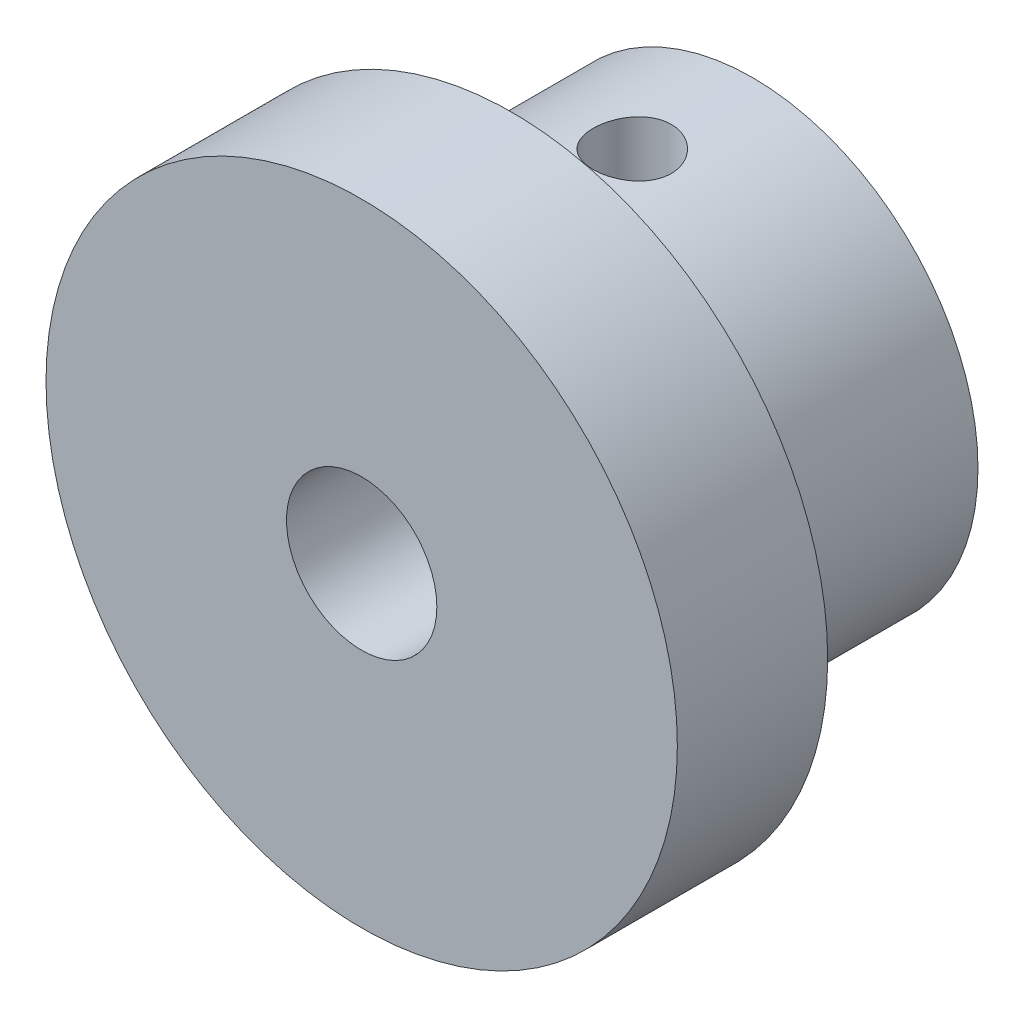
ISO-10303-21;
HEADER;
FILE_DESCRIPTION(('STEP AP214'),'2;1');
FILE_NAME('part.step','',(''),(''),'','','');
FILE_SCHEMA(('AUTOMOTIVE_DESIGN { 1 0 10303 214 1 1 1 1 }'));
ENDSEC;
DATA;
#1=APPLICATION_CONTEXT('core data for automotive mechanical design processes');
#2=APPLICATION_PROTOCOL_DEFINITION('international standard','automotive_design',2000,#1);
#3=PRODUCT_CONTEXT('',#1,'mechanical');
#4=PRODUCT('Part','Part','',(#3));
#5=PRODUCT_RELATED_PRODUCT_CATEGORY('part','',(#4));
#6=PRODUCT_DEFINITION_FORMATION('','',#4);
#7=PRODUCT_DEFINITION_CONTEXT('part definition',#1,'design');
#8=PRODUCT_DEFINITION('design','',#6,#7);
#9=PRODUCT_DEFINITION_SHAPE('','',#8);
#10=(LENGTH_UNIT() NAMED_UNIT(*) SI_UNIT(.MILLI.,.METRE.));
#11=(NAMED_UNIT(*) PLANE_ANGLE_UNIT() SI_UNIT($,.RADIAN.));
#12=(NAMED_UNIT(*) SI_UNIT($,.STERADIAN.) SOLID_ANGLE_UNIT());
#13=UNCERTAINTY_MEASURE_WITH_UNIT(LENGTH_MEASURE(1.E-05),#10,'distance_accuracy_value','');
#14=(GEOMETRIC_REPRESENTATION_CONTEXT(3) GLOBAL_UNCERTAINTY_ASSIGNED_CONTEXT((#13)) GLOBAL_UNIT_ASSIGNED_CONTEXT((#10,
#11,#12)) REPRESENTATION_CONTEXT('',''));
#15=CARTESIAN_POINT('',(0.,0.,0.));
#16=DIRECTION('',(0.,0.,1.));
#17=DIRECTION('',(1.,0.,0.));
#18=AXIS2_PLACEMENT_3D('',#15,#16,#17);
#19=CARTESIAN_POINT('',(0.,0.,8.));
#20=DIRECTION('',(0.,0.,-1.));
#21=DIRECTION('',(-1.,0.,0.));
#22=AXIS2_PLACEMENT_3D('',#19,#20,#21);
#23=CYLINDRICAL_SURFACE('',#22,7.5);
#24=CARTESIAN_POINT('',(0.,7.5,5.29999999999999));
#25=CARTESIAN_POINT('',(-0.0724398447909773,7.4999987322731,5.29999713480323));
#26=CARTESIAN_POINT('',(-0.144918145498401,7.49893959111151,5.29392469969313));
#27=CARTESIAN_POINT('',(-0.287838997586658,7.49481648528476,5.26980720285203));
#28=CARTESIAN_POINT('',(-0.358279665172153,7.49175072368937,5.25175140981125));
#29=CARTESIAN_POINT('',(-0.495037056079598,7.48395795984001,5.20423119988986));
#30=CARTESIAN_POINT('',(-0.561357206809018,7.47923236059877,5.17477641611242));
#31=CARTESIAN_POINT('',(-0.688106386865883,7.46863841510139,5.10532023268403));
#32=CARTESIAN_POINT('',(-0.748536027970825,7.46277018770667,5.06531992987327));
#33=CARTESIAN_POINT('',(-0.862419313309423,7.45047302958428,4.97546994807261));
#34=CARTESIAN_POINT('',(-0.915803450002364,7.44403942512245,4.92553279983517));
#35=CARTESIAN_POINT('',(-1.01347965377153,7.43137205523472,4.8174149060784));
#36=CARTESIAN_POINT('',(-1.05777112348898,7.42513830296116,4.75923361937002));
#37=CARTESIAN_POINT('',(-1.13628655313533,7.41353114747344,4.63579725464702));
#38=CARTESIAN_POINT('',(-1.17044116764746,7.40816378000777,4.57049745016679));
#39=CARTESIAN_POINT('',(-1.22726976900563,7.39896228385757,4.43497868799076));
#40=CARTESIAN_POINT('',(-1.24994459662756,7.39512804289169,4.36476009097467));
#41=CARTESIAN_POINT('',(-1.28294969888162,7.38947362434129,4.22213600107243));
#42=CARTESIAN_POINT('',(-1.29340036048532,7.38763381843554,4.14975916042963));
#43=CARTESIAN_POINT('',(-1.30203386434754,7.38611726921512,4.00425767205234));
#44=CARTESIAN_POINT('',(-1.30021764567898,7.38644036032304,3.93113308198861));
#45=CARTESIAN_POINT('',(-1.28446686747754,7.38919519389469,3.78707512790706));
#46=CARTESIAN_POINT('',(-1.2706680508966,7.3916033155293,3.71612640449628));
#47=CARTESIAN_POINT('',(-1.23155703181358,7.39821986273015,3.57756655497503));
#48=CARTESIAN_POINT('',(-1.2062444051644,7.4024283546183,3.50995555192163));
#49=CARTESIAN_POINT('',(-1.14468818219537,7.41219671468858,3.37958683427038));
#50=CARTESIAN_POINT('',(-1.10838869894239,7.41776346317574,3.31685604457137));
#51=CARTESIAN_POINT('',(-1.02592880229732,7.42961640016175,3.19832450375509));
#52=CARTESIAN_POINT('',(-0.979767529700656,7.43590265132482,3.14252435713771));
#53=CARTESIAN_POINT('',(-0.878157183611079,7.44858981776636,3.03865275882683));
#54=CARTESIAN_POINT('',(-0.822591753127176,7.4549911395167,2.99069510793105));
#55=CARTESIAN_POINT('',(-0.704142624944716,7.46710932055715,2.90476642988428));
#56=CARTESIAN_POINT('',(-0.641258872678944,7.47282617474308,2.86679547720346));
#57=CARTESIAN_POINT('',(-0.509847542269497,7.48294040591933,2.80190573776082));
#58=CARTESIAN_POINT('',(-0.441314626026443,7.48733651624691,2.77499755172079));
#59=CARTESIAN_POINT('',(-0.300608863131163,7.4943038992072,2.73310567344243));
#60=CARTESIAN_POINT('',(-0.228436346788359,7.49687533711874,2.71812090116639));
#61=CARTESIAN_POINT('',(-0.0834803980918329,7.49988127256183,2.70065675206772));
#62=CARTESIAN_POINT('',(-0.0107163105793022,7.50034244826514,2.69802124415496));
#63=CARTESIAN_POINT('',(0.134213405536291,7.49914915870502,2.70491339902996));
#64=CARTESIAN_POINT('',(0.206379058988119,7.49749478173288,2.71444055421652));
#65=CARTESIAN_POINT('',(0.347577136871395,7.49227281825126,2.74525774116925));
#66=CARTESIAN_POINT('',(0.416627055425048,7.4887178940511,2.76646994989062));
#67=CARTESIAN_POINT('',(0.55019060066028,7.48009179881856,2.81997175995333));
#68=CARTESIAN_POINT('',(0.614703955345471,7.47502053696749,2.85226202481471));
#69=CARTESIAN_POINT('',(0.738037625215484,7.46385795675312,2.92735722338536));
#70=CARTESIAN_POINT('',(0.796798103735989,7.4577574148199,2.97025903272262));
#71=CARTESIAN_POINT('',(0.90634150089479,7.44523944788984,3.06522690846743));
#72=CARTESIAN_POINT('',(0.957123789046545,7.43882199790155,3.11729369846039));
#73=CARTESIAN_POINT('',(1.04985252732064,7.42630654067611,3.22981588920068));
#74=CARTESIAN_POINT('',(1.09169315146389,7.42021293917705,3.29035906898262));
#75=CARTESIAN_POINT('',(1.16461025617444,7.40911930936297,3.4177063611878));
#76=CARTESIAN_POINT('',(1.19568709751513,7.40411924439757,3.48451026367288));
#77=CARTESIAN_POINT('',(1.24603871655471,7.39581234401479,3.62219518378742));
#78=CARTESIAN_POINT('',(1.26536488229816,7.39249814651775,3.69305694425807));
#79=CARTESIAN_POINT('',(1.2918273435619,7.3879202485671,3.83708358716461));
#80=CARTESIAN_POINT('',(1.29896479440461,7.38665635377357,3.9102482506474));
#81=CARTESIAN_POINT('',(1.30081300007085,7.38633100286296,4.05574612213087));
#82=CARTESIAN_POINT('',(1.2956904288562,7.38724000617502,4.12807720045278));
#83=CARTESIAN_POINT('',(1.2735257904453,7.39109305373654,4.27083133352559));
#84=CARTESIAN_POINT('',(1.2564837712523,7.3940370897903,4.34125439595946));
#85=CARTESIAN_POINT('',(1.21102987982703,7.40161688002661,4.47812121356259));
#86=CARTESIAN_POINT('',(1.18263350198151,7.40625032804721,4.54457025029067));
#87=CARTESIAN_POINT('',(1.11529439301075,7.41668890125424,4.67178799854623));
#88=CARTESIAN_POINT('',(1.07635106935154,7.42249409226526,4.73255639067345));
#89=CARTESIAN_POINT('',(0.988433390708102,7.43471511111115,4.84752777897955));
#90=CARTESIAN_POINT('',(0.939336807660156,7.44113781478104,4.90163659176602));
#91=CARTESIAN_POINT('',(0.832763269696979,7.45381640848232,5.00090416099672));
#92=CARTESIAN_POINT('',(0.775284387370081,7.46007225975557,5.04606085335595));
#93=CARTESIAN_POINT('',(0.653061699085757,7.4717671318827,5.12645560828061));
#94=CARTESIAN_POINT('',(0.588266425916335,7.47719964423843,5.16161638762511));
#95=CARTESIAN_POINT('',(0.453619362629126,7.48657240831697,5.22049906289207));
#96=CARTESIAN_POINT('',(0.383772598483327,7.49051411962616,5.24423215348015));
#97=CARTESIAN_POINT('',(0.261394898595106,7.49561824401892,5.2745359398695));
#98=CARTESIAN_POINT('',(0.209597073046708,7.49725246863215,5.28406935882905));
#99=CARTESIAN_POINT('',(0.105206249994944,7.49944379647523,5.29680236750822));
#100=CARTESIAN_POINT('',(0.0526132680507082,7.5000009207537,5.30000208100066));
#101=CARTESIAN_POINT('',(0.,7.5,5.29999999999999));
#102=B_SPLINE_CURVE_WITH_KNOTS('',3,(#24,#25,#26,#27,#28,#29,#30,#31,#32,#33,#34,#35,#36,#37,
#38,#39,#40,#41,#42,#43,#44,#45,#46,#47,#48,#49,#50,#51,#52,#53,#54,#55,#56,#57,#58,#59,#60,#61,
#62,#63,#64,#65,#66,#67,#68,#69,#70,#71,#72,#73,#74,#75,#76,#77,#78,#79,#80,#81,#82,#83,#84,#85,
#86,#87,#88,#89,#90,#91,#92,#93,#94,#95,#96,#97,#98,#99,#100,#101),.UNSPECIFIED.,.T.,.F.,(4,2,2,
2,2,2,2,2,2,2,2,2,2,2,2,2,2,2,2,2,2,2,2,2,2,2,2,2,2,2,2,2,2,2,2,2,2,2,4),(0.,0.217127189508833,
0.434449083106592,0.651587721116053,0.868703783424172,1.08782304649496,1.30695670038824,
1.52755659405949,1.74814032872786,1.96653289894895,2.18490875063849,2.40084256964326,
2.61678434388797,2.83384355716752,3.05092168936449,3.27091377018255,3.49090749142105,
3.71111152958697,3.93129561912501,4.14868828352059,4.36607187546455,4.58202488542516,
4.79799083214733,5.01600628447353,5.23403895708842,5.45452440261241,5.67500245733491,
5.8945092494248,6.11399523413675,6.33051431214473,6.54703251816937,6.76325626198093,
6.97949215589786,7.19850092823633,7.41756013871473,7.63826959904825,7.85876240832692,
8.01646559370506,8.17416569722804),.UNSPECIFIED.);
#103=CARTESIAN_POINT('',(0.,7.5,5.29999999999999));
#104=VERTEX_POINT('',#103);
#105=EDGE_CURVE('E67',#104,#104,#102,.T.);
#106=ORIENTED_EDGE('',*,*,#105,.T.);
#107=EDGE_LOOP('',(#106));
#108=FACE_BOUND('',#107,.T.);
#109=CARTESIAN_POINT('',(0.,0.,8.));
#110=DIRECTION('',(0.,0.,1.));
#111=DIRECTION('',(1.,0.,0.));
#112=AXIS2_PLACEMENT_3D('',#109,#110,#111);
#113=CIRCLE('',#112,7.5);
#114=CARTESIAN_POINT('',(7.5,0.,8.));
#115=VERTEX_POINT('',#114);
#116=EDGE_CURVE('E10',#115,#115,#113,.T.);
#117=ORIENTED_EDGE('',*,*,#116,.F.);
#118=EDGE_LOOP('',(#117));
#119=FACE_BOUND('',#118,.T.);
#120=CARTESIAN_POINT('',(0.,0.,0.));
#121=DIRECTION('',(0.,0.,1.));
#122=DIRECTION('',(1.,0.,0.));
#123=AXIS2_PLACEMENT_3D('',#120,#121,#122);
#124=CIRCLE('',#123,7.5);
#125=CARTESIAN_POINT('',(7.5,0.,0.));
#126=VERTEX_POINT('',#125);
#127=EDGE_CURVE('E44',#126,#126,#124,.T.);
#128=ORIENTED_EDGE('',*,*,#127,.T.);
#129=EDGE_LOOP('',(#128));
#130=FACE_BOUND('',#129,.T.);
#131=ADVANCED_FACE('F40',(#108,#119,#130),#23,.T.);
#132=CARTESIAN_POINT('',(0.,0.,0.));
#133=DIRECTION('',(0.,0.,1.));
#134=DIRECTION('',(1.,0.,0.));
#135=AXIS2_PLACEMENT_3D('',#132,#133,#134);
#136=PLANE('',#135);
#137=CARTESIAN_POINT('',(0.,0.,0.));
#138=DIRECTION('',(0.,0.,1.));
#139=DIRECTION('',(1.,0.,0.));
#140=AXIS2_PLACEMENT_3D('',#137,#138,#139);
#141=CIRCLE('',#140,2.5);
#142=CARTESIAN_POINT('',(2.5,0.,0.));
#143=VERTEX_POINT('',#142);
#144=EDGE_CURVE('E59',#143,#143,#141,.T.);
#145=ORIENTED_EDGE('',*,*,#144,.T.);
#146=EDGE_LOOP('',(#145));
#147=FACE_BOUND('',#146,.T.);
#148=ORIENTED_EDGE('',*,*,#127,.F.);
#149=EDGE_LOOP('',(#148));
#150=FACE_BOUND('',#149,.T.);
#151=ADVANCED_FACE('F103',(#147,#150),#136,.F.);
#152=CARTESIAN_POINT('',(0.,0.,13.));
#153=DIRECTION('',(0.,0.,-1.));
#154=DIRECTION('',(-1.,0.,0.));
#155=AXIS2_PLACEMENT_3D('',#152,#153,#154);
#156=CYLINDRICAL_SURFACE('',#155,10.5);
#157=CARTESIAN_POINT('',(0.,0.,13.));
#158=DIRECTION('',(0.,0.,1.));
#159=DIRECTION('',(1.,0.,0.));
#160=AXIS2_PLACEMENT_3D('',#157,#158,#159);
#161=CIRCLE('',#160,10.5);
#162=CARTESIAN_POINT('',(10.5,0.,13.));
#163=VERTEX_POINT('',#162);
#164=EDGE_CURVE('E53',#163,#163,#161,.T.);
#165=ORIENTED_EDGE('',*,*,#164,.F.);
#166=EDGE_LOOP('',(#165));
#167=FACE_BOUND('',#166,.T.);
#168=CARTESIAN_POINT('',(0.,0.,8.));
#169=DIRECTION('',(0.,0.,1.));
#170=DIRECTION('',(1.,0.,0.));
#171=AXIS2_PLACEMENT_3D('',#168,#169,#170);
#172=CIRCLE('',#171,10.5);
#173=CARTESIAN_POINT('',(10.5,0.,8.));
#174=VERTEX_POINT('',#173);
#175=EDGE_CURVE('E55',#174,#174,#172,.T.);
#176=ORIENTED_EDGE('',*,*,#175,.T.);
#177=EDGE_LOOP('',(#176));
#178=FACE_BOUND('',#177,.T.);
#179=ADVANCED_FACE('F98',(#167,#178),#156,.T.);
#180=CARTESIAN_POINT('',(0.,0.,13.));
#181=DIRECTION('',(0.,0.,1.));
#182=DIRECTION('',(1.,0.,0.));
#183=AXIS2_PLACEMENT_3D('',#180,#181,#182);
#184=PLANE('',#183);
#185=CARTESIAN_POINT('',(0.,0.,13.));
#186=DIRECTION('',(0.,0.,1.));
#187=DIRECTION('',(1.,0.,0.));
#188=AXIS2_PLACEMENT_3D('',#185,#186,#187);
#189=CIRCLE('',#188,2.5);
#190=CARTESIAN_POINT('',(2.5,0.,13.));
#191=VERTEX_POINT('',#190);
#192=EDGE_CURVE('E63',#191,#191,#189,.T.);
#193=ORIENTED_EDGE('',*,*,#192,.F.);
#194=EDGE_LOOP('',(#193));
#195=FACE_BOUND('',#194,.T.);
#196=ORIENTED_EDGE('',*,*,#164,.T.);
#197=EDGE_LOOP('',(#196));
#198=FACE_BOUND('',#197,.T.);
#199=ADVANCED_FACE('F95',(#195,#198),#184,.T.);
#200=CARTESIAN_POINT('',(0.,0.,8.));
#201=DIRECTION('',(0.,0.,1.));
#202=DIRECTION('',(1.,0.,0.));
#203=AXIS2_PLACEMENT_3D('',#200,#201,#202);
#204=PLANE('',#203);
#205=ORIENTED_EDGE('',*,*,#116,.T.);
#206=EDGE_LOOP('',(#205));
#207=FACE_BOUND('',#206,.T.);
#208=ORIENTED_EDGE('',*,*,#175,.F.);
#209=EDGE_LOOP('',(#208));
#210=FACE_BOUND('',#209,.T.);
#211=ADVANCED_FACE('F93',(#207,#210),#204,.F.);
#212=CARTESIAN_POINT('',(0.,0.,0.));
#213=DIRECTION('',(0.,0.,1.));
#214=DIRECTION('',(1.,0.,0.));
#215=AXIS2_PLACEMENT_3D('',#212,#213,#214);
#216=CYLINDRICAL_SURFACE('',#215,2.5);
#217=CARTESIAN_POINT('',(0.,2.5,5.29999999999999));
#218=CARTESIAN_POINT('',(0.0680113695059634,2.49999609902581,5.29999558097968));
#219=CARTESIAN_POINT('',(0.136093788180357,2.49719546987896,5.29463162297653));
#220=CARTESIAN_POINT('',(0.270225454250749,2.48626765671663,5.273423033882));
#221=CARTESIAN_POINT('',(0.336271062711259,2.47813145902996,5.25756066682731));
#222=CARTESIAN_POINT('',(0.464188472425047,2.45737911115534,5.21615407054803));
#223=CARTESIAN_POINT('',(0.526075766477187,2.44478082944565,5.19064843084437));
#224=CARTESIAN_POINT('',(0.64458920967504,2.41624205813435,5.13089060896186));
#225=CARTESIAN_POINT('',(0.701215505423522,2.40030166170432,5.0966386706068));
#226=CARTESIAN_POINT('',(0.81166759212663,2.3653250117645,5.01788312810977));
#227=CARTESIAN_POINT('',(0.865083381438265,2.34615603866433,4.97286439852767));
#228=CARTESIAN_POINT('',(0.963989056970096,2.30728290736442,4.87497055716436));
#229=CARTESIAN_POINT('',(1.00947237054757,2.28757832084618,4.8220889970174));
#230=CARTESIAN_POINT('',(1.09513753441025,2.24790755636024,4.70455845520348));
#231=CARTESIAN_POINT('',(1.13453247326665,2.22806332919205,4.63928969900798));
#232=CARTESIAN_POINT('',(1.20162263947399,2.19261300871779,4.5019286437702));
#233=CARTESIAN_POINT('',(1.22932667033736,2.17700372957641,4.4298415293584));
#234=CARTESIAN_POINT('',(1.27036888654654,2.15329918557366,4.28538261934588));
#235=CARTESIAN_POINT('',(1.28448748494984,2.1447999806986,4.21330240270993));
#236=CARTESIAN_POINT('',(1.30032214599433,2.13524197560196,4.06733829912883));
#237=CARTESIAN_POINT('',(1.30205239339102,2.13417466584282,3.99345657226103));
#238=CARTESIAN_POINT('',(1.29363159633311,2.13928164525275,3.85649275191733));
#239=CARTESIAN_POINT('',(1.28501836836425,2.14451886326309,3.79327214308004));
#240=CARTESIAN_POINT('',(1.25884150775024,2.15998772155474,3.66934816643952));
#241=CARTESIAN_POINT('',(1.24127460315842,2.17022118755992,3.60864572762776));
#242=CARTESIAN_POINT('',(1.19739608727305,2.19473990584834,3.48975152758059));
#243=CARTESIAN_POINT('',(1.17089309730272,2.20911272964635,3.43164931861785));
#244=CARTESIAN_POINT('',(1.11004732855924,2.24030417293869,3.32042809671486));
#245=CARTESIAN_POINT('',(1.07570103709793,2.2571238870646,3.26731133163273));
#246=CARTESIAN_POINT('',(0.994600690710101,2.29412683800401,3.15981655563225));
#247=CARTESIAN_POINT('',(0.946786597955368,2.31445310227271,3.10628463283547));
#248=CARTESIAN_POINT('',(0.842817041578247,2.35430677787375,3.00762978696943));
#249=CARTESIAN_POINT('',(0.786656980792258,2.37383374132281,2.96251152943353));
#250=CARTESIAN_POINT('',(0.663774127410598,2.41116994987061,2.87965060642806));
#251=CARTESIAN_POINT('',(0.596644646812703,2.4288294437478,2.84243795998662));
#252=CARTESIAN_POINT('',(0.455930966123092,2.45912356419007,2.78015071661923));
#253=CARTESIAN_POINT('',(0.382352338507071,2.47176247761752,2.75506576037823));
#254=CARTESIAN_POINT('',(0.237696689390573,2.48964687281174,2.7199421707391));
#255=CARTESIAN_POINT('',(0.166960386836864,2.49544064536842,2.70878288196254));
#256=CARTESIAN_POINT('',(0.0243942042796416,2.50089635599645,2.6982683279208));
#257=CARTESIAN_POINT('',(-0.0474350713497854,2.50056156803526,2.69890676014066));
#258=CARTESIAN_POINT('',(-0.183618209438066,2.49410050655221,2.71137313423458));
#259=CARTESIAN_POINT('',(-0.248087136366193,2.48847062394008,2.72224207915056));
#260=CARTESIAN_POINT('',(-0.374141031441014,2.47266151578169,2.75331102944845));
#261=CARTESIAN_POINT('',(-0.435725691885607,2.46248180606224,2.77351202791539));
#262=CARTESIAN_POINT('',(-0.55618110520896,2.43814302074764,2.82313115942012));
#263=CARTESIAN_POINT('',(-0.614936096743493,2.4238852987495,2.85278017014389));
#264=CARTESIAN_POINT('',(-0.726817602279268,2.39272108080907,2.92018210792856));
#265=CARTESIAN_POINT('',(-0.779941812395782,2.37581350761577,2.95793833315712));
#266=CARTESIAN_POINT('',(-0.884925243858757,2.33887075877338,3.04499803288043));
#267=CARTESIAN_POINT('',(-0.936078033693246,2.31869319367569,3.09509413429453));
#268=CARTESIAN_POINT('',(-1.02959738484077,2.27871043976582,3.20310677159969));
#269=CARTESIAN_POINT('',(-1.07195663837658,2.25890557300989,3.26102974646841));
#270=CARTESIAN_POINT('',(-1.14910272035529,2.22070397734203,3.38733673410915));
#271=CARTESIAN_POINT('',(-1.18328973831135,2.20246093456135,3.45613791542058));
#272=CARTESIAN_POINT('',(-1.23924098239167,2.17147835100918,3.59975141512398));
#273=CARTESIAN_POINT('',(-1.26102233570193,2.15873122854439,3.67455528255512));
#274=CARTESIAN_POINT('',(-1.28943999012578,2.14186687422015,3.82027124591388));
#275=CARTESIAN_POINT('',(-1.29734839119878,2.13702798664101,3.89084921061157));
#276=CARTESIAN_POINT('',(-1.3015203399281,2.13449180299613,4.0324609798733));
#277=CARTESIAN_POINT('',(-1.2977904998874,2.13679045171326,4.10349450272353));
#278=CARTESIAN_POINT('',(-1.2800034542772,2.14748109373078,4.23567610593051));
#279=CARTESIAN_POINT('',(-1.26713384169056,2.15517118633996,4.29704873313192));
#280=CARTESIAN_POINT('',(-1.23298733247354,2.17488587021126,4.41666977993838));
#281=CARTESIAN_POINT('',(-1.21170751826452,2.18691196554666,4.4749171073746));
#282=CARTESIAN_POINT('',(-1.15979270017152,2.21490467413759,4.59091755995026));
#283=CARTESIAN_POINT('',(-1.12863261878602,2.23107909446047,4.64838392984563));
#284=CARTESIAN_POINT('',(-1.05838667201273,2.2652468080127,4.7576554103908));
#285=CARTESIAN_POINT('',(-1.01929655715553,2.28324107383964,4.80945746269853));
#286=CARTESIAN_POINT('',(-0.928121386241808,2.3219301192689,4.91322632204944));
#287=CARTESIAN_POINT('',(-0.874994006967031,2.34266114669507,4.96426887192055));
#288=CARTESIAN_POINT('',(-0.760430106723434,2.38231377154674,5.05696539628012));
#289=CARTESIAN_POINT('',(-0.698988646857167,2.40123428195996,5.09861375071995));
#290=CARTESIAN_POINT('',(-0.567986350348213,2.43558032718761,5.17179940036644));
#291=CARTESIAN_POINT('',(-0.49830671221909,2.45094198545967,5.20315557424179));
#292=CARTESIAN_POINT('',(-0.353697863564507,2.47593211426922,5.25328257101943));
#293=CARTESIAN_POINT('',(-0.278783693118584,2.48557631190442,5.27208793572085));
#294=CARTESIAN_POINT('',(-0.169188039913597,2.49449662438316,5.28939079306565));
#295=CARTESIAN_POINT('',(-0.13551306404705,2.49655400233432,5.29336255907374));
#296=CARTESIAN_POINT('',(-0.0678979669149623,2.49930667952064,5.29866829577143));
#297=CARTESIAN_POINT('',(-0.0339578396300281,2.50000194774281,5.30000220640142));
#298=CARTESIAN_POINT('',(0.,2.5,5.29999999999999));
#299=B_SPLINE_CURVE_WITH_KNOTS('',3,(#217,#218,#219,#220,#221,#222,#223,#224,#225,#226,#227,
#228,#229,#230,#231,#232,#233,#234,#235,#236,#237,#238,#239,#240,#241,#242,#243,#244,#245,#246,
#247,#248,#249,#250,#251,#252,#253,#254,#255,#256,#257,#258,#259,#260,#261,#262,#263,#264,#265,
#266,#267,#268,#269,#270,#271,#272,#273,#274,#275,#276,#277,#278,#279,#280,#281,#282,#283,#284,
#285,#286,#287,#288,#289,#290,#291,#292,#293,#294,#295,#296,#297,#298),.UNSPECIFIED.,.T.,.F.,(4,
2,2,2,2,2,2,2,2,2,2,2,2,2,2,2,2,2,2,2,2,2,2,2,2,2,2,2,2,2,2,2,2,2,2,2,2,2,2,2,4),(0.,
0.203896806366285,0.408138957322477,0.611572296877391,0.814999965865627,1.03142326439271,
1.24802504237353,1.48316517792175,1.71812793040786,1.93860407014475,2.15882772260557,
2.34998891208855,2.54122000784162,2.73683841649128,2.9325446069,3.15538331852189,
3.37834523326736,3.61335022619279,3.84815412468366,4.06249724663535,4.27672586667118,
4.47268293759257,4.66866086639621,4.8698516955817,5.07112452858473,5.2933343320654,
5.51572806791227,5.75134168970872,5.98662923131481,6.19892188281191,6.41109394154318,
6.59980430594199,6.78858019329842,6.98982480284756,7.19117753962885,7.41974793265729,
7.64845470667185,7.88099383218264,8.11289030496959,8.21469295152369,8.31649791592827),.UNSPECIFIED.);
#300=CARTESIAN_POINT('',(0.,2.5,5.29999999999999));
#301=VERTEX_POINT('',#300);
#302=EDGE_CURVE('E78',#301,#301,#299,.T.);
#303=ORIENTED_EDGE('',*,*,#302,.T.);
#304=EDGE_LOOP('',(#303));
#305=FACE_BOUND('',#304,.T.);
#306=ORIENTED_EDGE('',*,*,#144,.F.);
#307=EDGE_LOOP('',(#306));
#308=FACE_BOUND('',#307,.T.);
#309=ORIENTED_EDGE('',*,*,#192,.T.);
#310=EDGE_LOOP('',(#309));
#311=FACE_BOUND('',#310,.T.);
#312=ADVANCED_FACE('F86',(#305,#308,#311),#216,.F.);
#313=CARTESIAN_POINT('',(0.,7.5,4.));
#314=DIRECTION('',(0.,1.,0.));
#315=DIRECTION('',(0.,0.,1.));
#316=AXIS2_PLACEMENT_3D('',#313,#314,#315);
#317=CYLINDRICAL_SURFACE('',#316,1.29999999999999);
#318=ORIENTED_EDGE('',*,*,#302,.F.);
#319=EDGE_LOOP('',(#318));
#320=FACE_BOUND('',#319,.T.);
#321=ORIENTED_EDGE('',*,*,#105,.F.);
#322=EDGE_LOOP('',(#321));
#323=FACE_BOUND('',#322,.T.);
#324=ADVANCED_FACE('F83',(#320,#323),#317,.F.);
#325=CLOSED_SHELL('',(#131,#151,#179,#199,#211,#312,#324));
#326=MANIFOLD_SOLID_BREP('B2',#325);
#327=ADVANCED_BREP_SHAPE_REPRESENTATION('',(#18,#326),#14);
#328=SHAPE_DEFINITION_REPRESENTATION(#9,#327);
ENDSEC;
END-ISO-10303-21;
